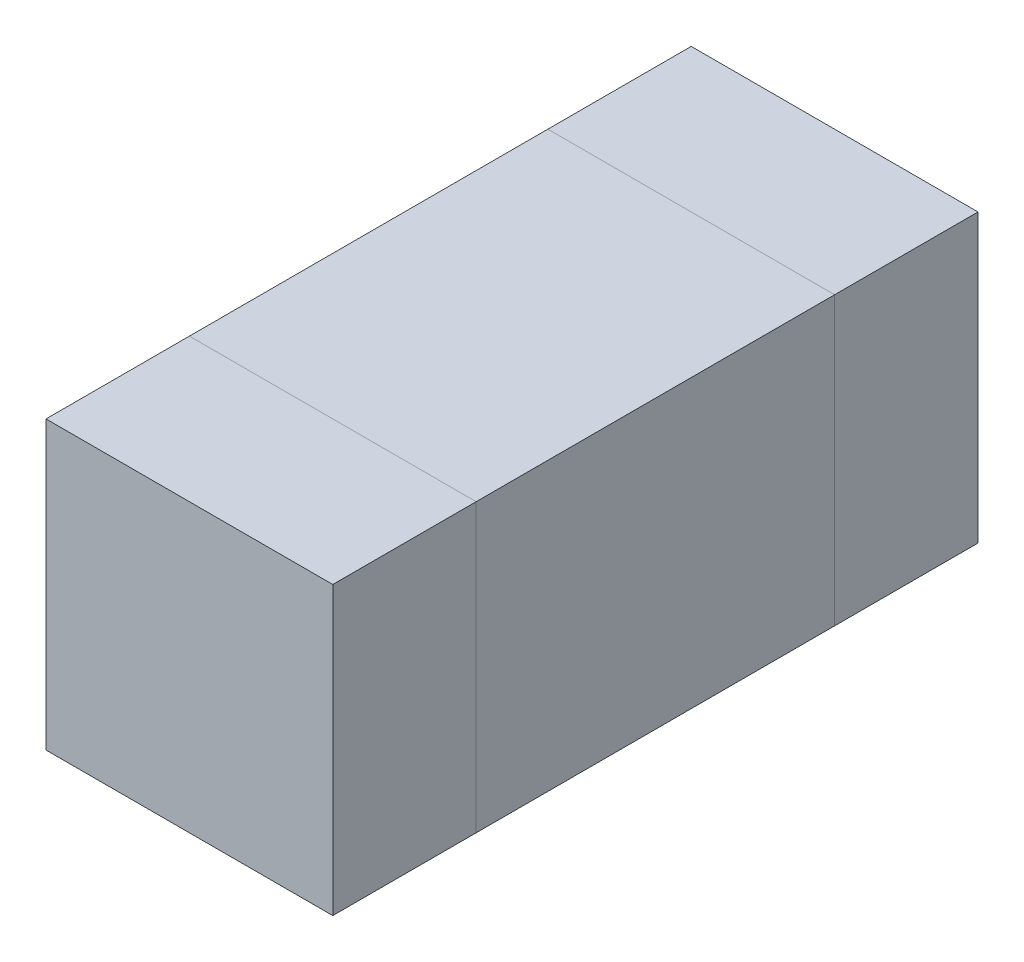
ISO-10303-21;
HEADER;
FILE_DESCRIPTION(('STEP AP214'),'2;1');
FILE_NAME('part.step','',(''),(''),'','','');
FILE_SCHEMA(('AUTOMOTIVE_DESIGN { 1 0 10303 214 1 1 1 1 }'));
ENDSEC;
DATA;
#1=APPLICATION_CONTEXT('core data for automotive mechanical design processes');
#2=APPLICATION_PROTOCOL_DEFINITION('international standard','automotive_design',2000,#1);
#3=PRODUCT_CONTEXT('',#1,'mechanical');
#4=PRODUCT('Part','Part','',(#3));
#5=PRODUCT_RELATED_PRODUCT_CATEGORY('part','',(#4));
#6=PRODUCT_DEFINITION_FORMATION('','',#4);
#7=PRODUCT_DEFINITION_CONTEXT('part definition',#1,'design');
#8=PRODUCT_DEFINITION('design','',#6,#7);
#9=PRODUCT_DEFINITION_SHAPE('','',#8);
#10=(LENGTH_UNIT() NAMED_UNIT(*) SI_UNIT(.MILLI.,.METRE.));
#11=(NAMED_UNIT(*) PLANE_ANGLE_UNIT() SI_UNIT($,.RADIAN.));
#12=(NAMED_UNIT(*) SI_UNIT($,.STERADIAN.) SOLID_ANGLE_UNIT());
#13=UNCERTAINTY_MEASURE_WITH_UNIT(LENGTH_MEASURE(1.E-05),#10,'distance_accuracy_value','');
#14=(GEOMETRIC_REPRESENTATION_CONTEXT(3) GLOBAL_UNCERTAINTY_ASSIGNED_CONTEXT((#13)) GLOBAL_UNIT_ASSIGNED_CONTEXT((#10,
#11,#12)) REPRESENTATION_CONTEXT('',''));
#15=CARTESIAN_POINT('',(0.,0.,0.));
#16=DIRECTION('',(0.,0.,1.));
#17=DIRECTION('',(1.,0.,0.));
#18=AXIS2_PLACEMENT_3D('',#15,#16,#17);
#19=CARTESIAN_POINT('',(0.,0.8,0.));
#20=DIRECTION('',(0.,1.,0.));
#21=DIRECTION('',(0.,0.,1.));
#22=AXIS2_PLACEMENT_3D('',#19,#20,#21);
#23=PLANE('',#22);
#24=DIRECTION('',(0.,0.,-1.));
#25=VECTOR('',#24,1.);
#26=CARTESIAN_POINT('',(-0.4,0.8,-0.5));
#27=LINE('',#26,#25);
#28=CARTESIAN_POINT('',(-0.4,0.8,-0.5));
#29=VERTEX_POINT('',#28);
#30=CARTESIAN_POINT('',(-0.4,0.8,-0.9));
#31=VERTEX_POINT('',#30);
#32=EDGE_CURVE('E55',#29,#31,#27,.T.);
#33=ORIENTED_EDGE('',*,*,#32,.F.);
#34=DIRECTION('',(-1.,0.,0.));
#35=VECTOR('',#34,1.);
#36=CARTESIAN_POINT('',(-0.4,0.8,-0.5));
#37=LINE('',#36,#35);
#38=CARTESIAN_POINT('',(0.4,0.8,-0.5));
#39=VERTEX_POINT('',#38);
#40=EDGE_CURVE('E78',#39,#29,#37,.T.);
#41=ORIENTED_EDGE('',*,*,#40,.F.);
#42=DIRECTION('',(0.,0.,1.));
#43=VECTOR('',#42,1.);
#44=CARTESIAN_POINT('',(0.4,0.8,-0.5));
#45=LINE('',#44,#43);
#46=CARTESIAN_POINT('',(0.4,0.8,-0.9));
#47=VERTEX_POINT('',#46);
#48=EDGE_CURVE('E83',#47,#39,#45,.T.);
#49=ORIENTED_EDGE('',*,*,#48,.F.);
#50=DIRECTION('',(1.,0.,0.));
#51=VECTOR('',#50,1.);
#52=CARTESIAN_POINT('',(-0.4,0.8,-0.9));
#53=LINE('',#52,#51);
#54=EDGE_CURVE('E98',#31,#47,#53,.T.);
#55=ORIENTED_EDGE('',*,*,#54,.F.);
#56=EDGE_LOOP('',(#33,#41,#49,#55));
#57=FACE_BOUND('',#56,.T.);
#58=ADVANCED_FACE('F47',(#57),#23,.T.);
#59=CARTESIAN_POINT('',(0.,0.,0.));
#60=DIRECTION('',(0.,-1.,0.));
#61=DIRECTION('',(0.,0.,-1.));
#62=AXIS2_PLACEMENT_3D('',#59,#60,#61);
#63=PLANE('',#62);
#64=DIRECTION('',(0.,0.,-1.));
#65=VECTOR('',#64,1.);
#66=CARTESIAN_POINT('',(-0.4,0.,-0.5));
#67=LINE('',#66,#65);
#68=CARTESIAN_POINT('',(-0.4,0.,-0.5));
#69=VERTEX_POINT('',#68);
#70=CARTESIAN_POINT('',(-0.4,0.,-0.9));
#71=VERTEX_POINT('',#70);
#72=EDGE_CURVE('E107',#69,#71,#67,.T.);
#73=ORIENTED_EDGE('',*,*,#72,.T.);
#74=DIRECTION('',(1.,0.,0.));
#75=VECTOR('',#74,1.);
#76=CARTESIAN_POINT('',(-0.4,0.,-0.9));
#77=LINE('',#76,#75);
#78=CARTESIAN_POINT('',(0.4,0.,-0.9));
#79=VERTEX_POINT('',#78);
#80=EDGE_CURVE('E96',#71,#79,#77,.T.);
#81=ORIENTED_EDGE('',*,*,#80,.T.);
#82=DIRECTION('',(0.,0.,1.));
#83=VECTOR('',#82,1.);
#84=CARTESIAN_POINT('',(0.4,0.,-0.5));
#85=LINE('',#84,#83);
#86=CARTESIAN_POINT('',(0.4,0.,-0.5));
#87=VERTEX_POINT('',#86);
#88=EDGE_CURVE('E99',#79,#87,#85,.T.);
#89=ORIENTED_EDGE('',*,*,#88,.T.);
#90=DIRECTION('',(-1.,0.,0.));
#91=VECTOR('',#90,1.);
#92=CARTESIAN_POINT('',(-0.4,0.,-0.5));
#93=LINE('',#92,#91);
#94=EDGE_CURVE('E104',#87,#69,#93,.T.);
#95=ORIENTED_EDGE('',*,*,#94,.T.);
#96=EDGE_LOOP('',(#73,#81,#89,#95));
#97=FACE_BOUND('',#96,.T.);
#98=ADVANCED_FACE('F106',(#97),#63,.T.);
#99=CARTESIAN_POINT('',(-0.4,1.69442719099992,-0.9));
#100=DIRECTION('',(0.,0.,-1.));
#101=DIRECTION('',(-1.,0.,0.));
#102=AXIS2_PLACEMENT_3D('',#99,#100,#101);
#103=PLANE('',#102);
#104=DIRECTION('',(0.,-1.,0.));
#105=VECTOR('',#104,1.);
#106=CARTESIAN_POINT('',(-0.4,1.69442719099992,-0.9));
#107=LINE('',#106,#105);
#108=EDGE_CURVE('E12',#31,#71,#107,.T.);
#109=ORIENTED_EDGE('',*,*,#108,.F.);
#110=ORIENTED_EDGE('',*,*,#54,.T.);
#111=DIRECTION('',(0.,-1.,0.));
#112=VECTOR('',#111,1.);
#113=CARTESIAN_POINT('',(0.4,1.69442719099992,-0.9));
#114=LINE('',#113,#112);
#115=EDGE_CURVE('E93',#47,#79,#114,.T.);
#116=ORIENTED_EDGE('',*,*,#115,.T.);
#117=ORIENTED_EDGE('',*,*,#80,.F.);
#118=EDGE_LOOP('',(#109,#110,#116,#117));
#119=FACE_BOUND('',#118,.T.);
#120=ADVANCED_FACE('F94',(#119),#103,.T.);
#121=CARTESIAN_POINT('',(0.4,1.69442719099992,-0.5));
#122=DIRECTION('',(1.,0.,0.));
#123=DIRECTION('',(0.,0.,-1.));
#124=AXIS2_PLACEMENT_3D('',#121,#122,#123);
#125=PLANE('',#124);
#126=ORIENTED_EDGE('',*,*,#115,.F.);
#127=ORIENTED_EDGE('',*,*,#48,.T.);
#128=DIRECTION('',(0.,-1.,0.));
#129=VECTOR('',#128,1.);
#130=CARTESIAN_POINT('',(0.4,1.69442719099992,-0.5));
#131=LINE('',#130,#129);
#132=EDGE_CURVE('E88',#39,#87,#131,.T.);
#133=ORIENTED_EDGE('',*,*,#132,.T.);
#134=ORIENTED_EDGE('',*,*,#88,.F.);
#135=EDGE_LOOP('',(#126,#127,#133,#134));
#136=FACE_BOUND('',#135,.T.);
#137=ADVANCED_FACE('F100',(#136),#125,.T.);
#138=CARTESIAN_POINT('',(-0.4,1.69442719099992,-0.5));
#139=DIRECTION('',(0.,0.,1.));
#140=DIRECTION('',(1.,0.,0.));
#141=AXIS2_PLACEMENT_3D('',#138,#139,#140);
#142=PLANE('',#141);
#143=ORIENTED_EDGE('',*,*,#132,.F.);
#144=ORIENTED_EDGE('',*,*,#40,.T.);
#145=DIRECTION('',(0.,-1.,0.));
#146=VECTOR('',#145,1.);
#147=CARTESIAN_POINT('',(-0.4,1.69442719099992,-0.5));
#148=LINE('',#147,#146);
#149=EDGE_CURVE('E114',#29,#69,#148,.T.);
#150=ORIENTED_EDGE('',*,*,#149,.T.);
#151=ORIENTED_EDGE('',*,*,#94,.F.);
#152=EDGE_LOOP('',(#143,#144,#150,#151));
#153=FACE_BOUND('',#152,.T.);
#154=ADVANCED_FACE('F120',(#153),#142,.T.);
#155=CARTESIAN_POINT('',(-0.4,1.69442719099992,-0.5));
#156=DIRECTION('',(-1.,0.,0.));
#157=DIRECTION('',(0.,0.,1.));
#158=AXIS2_PLACEMENT_3D('',#155,#156,#157);
#159=PLANE('',#158);
#160=ORIENTED_EDGE('',*,*,#149,.F.);
#161=ORIENTED_EDGE('',*,*,#32,.T.);
#162=ORIENTED_EDGE('',*,*,#108,.T.);
#163=ORIENTED_EDGE('',*,*,#72,.F.);
#164=EDGE_LOOP('',(#160,#161,#162,#163));
#165=FACE_BOUND('',#164,.T.);
#166=ADVANCED_FACE('F121',(#165),#159,.T.);
#167=CLOSED_SHELL('',(#58,#98,#120,#137,#154,#166));
#168=MANIFOLD_SOLID_BREP('B2',#167);
#169=CARTESIAN_POINT('',(0.,0.8,0.));
#170=DIRECTION('',(0.,1.,0.));
#171=DIRECTION('',(0.,0.,1.));
#172=AXIS2_PLACEMENT_3D('',#169,#170,#171);
#173=PLANE('',#172);
#174=DIRECTION('',(0.,0.,-1.));
#175=VECTOR('',#174,1.);
#176=CARTESIAN_POINT('',(-0.4,0.8,0.5));
#177=LINE('',#176,#175);
#178=CARTESIAN_POINT('',(-0.4,0.8,0.9));
#179=VERTEX_POINT('',#178);
#180=CARTESIAN_POINT('',(-0.4,0.8,0.5));
#181=VERTEX_POINT('',#180);
#182=EDGE_CURVE('E187',#179,#181,#177,.T.);
#183=ORIENTED_EDGE('',*,*,#182,.F.);
#184=DIRECTION('',(-1.,0.,0.));
#185=VECTOR('',#184,1.);
#186=CARTESIAN_POINT('',(-0.4,0.8,0.9));
#187=LINE('',#186,#185);
#188=CARTESIAN_POINT('',(0.4,0.8,0.9));
#189=VERTEX_POINT('',#188);
#190=EDGE_CURVE('E210',#189,#179,#187,.T.);
#191=ORIENTED_EDGE('',*,*,#190,.F.);
#192=DIRECTION('',(0.,0.,1.));
#193=VECTOR('',#192,1.);
#194=CARTESIAN_POINT('',(0.4,0.8,0.5));
#195=LINE('',#194,#193);
#196=CARTESIAN_POINT('',(0.4,0.8,0.5));
#197=VERTEX_POINT('',#196);
#198=EDGE_CURVE('E215',#197,#189,#195,.T.);
#199=ORIENTED_EDGE('',*,*,#198,.F.);
#200=DIRECTION('',(1.,0.,0.));
#201=VECTOR('',#200,1.);
#202=CARTESIAN_POINT('',(-0.4,0.8,0.5));
#203=LINE('',#202,#201);
#204=EDGE_CURVE('E230',#181,#197,#203,.T.);
#205=ORIENTED_EDGE('',*,*,#204,.F.);
#206=EDGE_LOOP('',(#183,#191,#199,#205));
#207=FACE_BOUND('',#206,.T.);
#208=ADVANCED_FACE('F179',(#207),#173,.T.);
#209=CARTESIAN_POINT('',(0.,0.,0.));
#210=DIRECTION('',(0.,1.,0.));
#211=DIRECTION('',(0.,0.,1.));
#212=AXIS2_PLACEMENT_3D('',#209,#210,#211);
#213=PLANE('',#212);
#214=DIRECTION('',(0.,0.,-1.));
#215=VECTOR('',#214,1.);
#216=CARTESIAN_POINT('',(-0.4,0.,0.5));
#217=LINE('',#216,#215);
#218=CARTESIAN_POINT('',(-0.4,0.,0.9));
#219=VERTEX_POINT('',#218);
#220=CARTESIAN_POINT('',(-0.4,0.,0.5));
#221=VERTEX_POINT('',#220);
#222=EDGE_CURVE('E239',#219,#221,#217,.T.);
#223=ORIENTED_EDGE('',*,*,#222,.T.);
#224=DIRECTION('',(1.,0.,0.));
#225=VECTOR('',#224,1.);
#226=CARTESIAN_POINT('',(-0.4,0.,0.5));
#227=LINE('',#226,#225);
#228=CARTESIAN_POINT('',(0.4,0.,0.5));
#229=VERTEX_POINT('',#228);
#230=EDGE_CURVE('E228',#221,#229,#227,.T.);
#231=ORIENTED_EDGE('',*,*,#230,.T.);
#232=DIRECTION('',(0.,0.,1.));
#233=VECTOR('',#232,1.);
#234=CARTESIAN_POINT('',(0.4,0.,0.5));
#235=LINE('',#234,#233);
#236=CARTESIAN_POINT('',(0.4,0.,0.9));
#237=VERTEX_POINT('',#236);
#238=EDGE_CURVE('E231',#229,#237,#235,.T.);
#239=ORIENTED_EDGE('',*,*,#238,.T.);
#240=DIRECTION('',(-1.,0.,0.));
#241=VECTOR('',#240,1.);
#242=CARTESIAN_POINT('',(-0.4,0.,0.9));
#243=LINE('',#242,#241);
#244=EDGE_CURVE('E236',#237,#219,#243,.T.);
#245=ORIENTED_EDGE('',*,*,#244,.T.);
#246=EDGE_LOOP('',(#223,#231,#239,#245));
#247=FACE_BOUND('',#246,.T.);
#248=ADVANCED_FACE('F238',(#247),#213,.F.);
#249=CARTESIAN_POINT('',(-0.4,1.69442719099992,0.5));
#250=DIRECTION('',(0.,0.,-1.));
#251=DIRECTION('',(-1.,0.,0.));
#252=AXIS2_PLACEMENT_3D('',#249,#250,#251);
#253=PLANE('',#252);
#254=DIRECTION('',(0.,-1.,0.));
#255=VECTOR('',#254,1.);
#256=CARTESIAN_POINT('',(-0.4,1.69442719099992,0.5));
#257=LINE('',#256,#255);
#258=EDGE_CURVE('E45',#181,#221,#257,.T.);
#259=ORIENTED_EDGE('',*,*,#258,.F.);
#260=ORIENTED_EDGE('',*,*,#204,.T.);
#261=DIRECTION('',(0.,-1.,0.));
#262=VECTOR('',#261,1.);
#263=CARTESIAN_POINT('',(0.4,1.69442719099992,0.5));
#264=LINE('',#263,#262);
#265=EDGE_CURVE('E225',#197,#229,#264,.T.);
#266=ORIENTED_EDGE('',*,*,#265,.T.);
#267=ORIENTED_EDGE('',*,*,#230,.F.);
#268=EDGE_LOOP('',(#259,#260,#266,#267));
#269=FACE_BOUND('',#268,.T.);
#270=ADVANCED_FACE('F226',(#269),#253,.T.);
#271=CARTESIAN_POINT('',(0.4,1.69442719099992,0.5));
#272=DIRECTION('',(1.,0.,0.));
#273=DIRECTION('',(0.,0.,-1.));
#274=AXIS2_PLACEMENT_3D('',#271,#272,#273);
#275=PLANE('',#274);
#276=ORIENTED_EDGE('',*,*,#265,.F.);
#277=ORIENTED_EDGE('',*,*,#198,.T.);
#278=DIRECTION('',(0.,-1.,0.));
#279=VECTOR('',#278,1.);
#280=CARTESIAN_POINT('',(0.4,1.69442719099992,0.9));
#281=LINE('',#280,#279);
#282=EDGE_CURVE('E220',#189,#237,#281,.T.);
#283=ORIENTED_EDGE('',*,*,#282,.T.);
#284=ORIENTED_EDGE('',*,*,#238,.F.);
#285=EDGE_LOOP('',(#276,#277,#283,#284));
#286=FACE_BOUND('',#285,.T.);
#287=ADVANCED_FACE('F232',(#286),#275,.T.);
#288=CARTESIAN_POINT('',(-0.4,1.69442719099992,0.9));
#289=DIRECTION('',(0.,0.,1.));
#290=DIRECTION('',(1.,0.,0.));
#291=AXIS2_PLACEMENT_3D('',#288,#289,#290);
#292=PLANE('',#291);
#293=ORIENTED_EDGE('',*,*,#282,.F.);
#294=ORIENTED_EDGE('',*,*,#190,.T.);
#295=DIRECTION('',(0.,-1.,0.));
#296=VECTOR('',#295,1.);
#297=CARTESIAN_POINT('',(-0.4,1.69442719099992,0.9));
#298=LINE('',#297,#296);
#299=EDGE_CURVE('E246',#179,#219,#298,.T.);
#300=ORIENTED_EDGE('',*,*,#299,.T.);
#301=ORIENTED_EDGE('',*,*,#244,.F.);
#302=EDGE_LOOP('',(#293,#294,#300,#301));
#303=FACE_BOUND('',#302,.T.);
#304=ADVANCED_FACE('F252',(#303),#292,.T.);
#305=CARTESIAN_POINT('',(-0.4,1.69442719099992,0.5));
#306=DIRECTION('',(-1.,0.,0.));
#307=DIRECTION('',(0.,0.,1.));
#308=AXIS2_PLACEMENT_3D('',#305,#306,#307);
#309=PLANE('',#308);
#310=ORIENTED_EDGE('',*,*,#299,.F.);
#311=ORIENTED_EDGE('',*,*,#182,.T.);
#312=ORIENTED_EDGE('',*,*,#258,.T.);
#313=ORIENTED_EDGE('',*,*,#222,.F.);
#314=EDGE_LOOP('',(#310,#311,#312,#313));
#315=FACE_BOUND('',#314,.T.);
#316=ADVANCED_FACE('F253',(#315),#309,.T.);
#317=CLOSED_SHELL('',(#208,#248,#270,#287,#304,#316));
#318=MANIFOLD_SOLID_BREP('B6',#317);
#319=CARTESIAN_POINT('',(0.4,0.8,-0.5));
#320=DIRECTION('',(-1.,0.,0.));
#321=DIRECTION('',(0.,0.,1.));
#322=AXIS2_PLACEMENT_3D('',#319,#320,#321);
#323=PLANE('',#322);
#324=DIRECTION('',(0.,0.,-1.));
#325=VECTOR('',#324,1.);
#326=CARTESIAN_POINT('',(0.4,0.,-0.5));
#327=LINE('',#326,#325);
#328=CARTESIAN_POINT('',(0.4,0.,0.5));
#329=VERTEX_POINT('',#328);
#330=CARTESIAN_POINT('',(0.4,0.,-0.5));
#331=VERTEX_POINT('',#330);
#332=EDGE_CURVE('E365',#329,#331,#327,.T.);
#333=ORIENTED_EDGE('',*,*,#332,.T.);
#334=DIRECTION('',(0.,-1.,0.));
#335=VECTOR('',#334,1.);
#336=CARTESIAN_POINT('',(0.4,0.8,-0.5));
#337=LINE('',#336,#335);
#338=CARTESIAN_POINT('',(0.4,0.8,-0.5));
#339=VERTEX_POINT('',#338);
#340=EDGE_CURVE('E177',#339,#331,#337,.T.);
#341=ORIENTED_EDGE('',*,*,#340,.F.);
#342=DIRECTION('',(0.,0.,-1.));
#343=VECTOR('',#342,1.);
#344=CARTESIAN_POINT('',(0.4,0.8,-0.5));
#345=LINE('',#344,#343);
#346=CARTESIAN_POINT('',(0.4,0.8,0.5));
#347=VERTEX_POINT('',#346);
#348=EDGE_CURVE('E353',#347,#339,#345,.T.);
#349=ORIENTED_EDGE('',*,*,#348,.F.);
#350=DIRECTION('',(0.,-1.,0.));
#351=VECTOR('',#350,1.);
#352=CARTESIAN_POINT('',(0.4,0.8,0.5));
#353=LINE('',#352,#351);
#354=EDGE_CURVE('E361',#347,#329,#353,.T.);
#355=ORIENTED_EDGE('',*,*,#354,.T.);
#356=EDGE_LOOP('',(#333,#341,#349,#355));
#357=FACE_BOUND('',#356,.T.);
#358=ADVANCED_FACE('F302',(#357),#323,.F.);
#359=CARTESIAN_POINT('',(-0.4,0.8,-0.5));
#360=DIRECTION('',(0.,0.,1.));
#361=DIRECTION('',(1.,0.,0.));
#362=AXIS2_PLACEMENT_3D('',#359,#360,#361);
#363=PLANE('',#362);
#364=DIRECTION('',(-1.,0.,0.));
#365=VECTOR('',#364,1.);
#366=CARTESIAN_POINT('',(-0.4,0.,-0.5));
#367=LINE('',#366,#365);
#368=CARTESIAN_POINT('',(-0.4,0.,-0.5));
#369=VERTEX_POINT('',#368);
#370=EDGE_CURVE('E357',#331,#369,#367,.T.);
#371=ORIENTED_EDGE('',*,*,#370,.T.);
#372=DIRECTION('',(0.,-1.,0.));
#373=VECTOR('',#372,1.);
#374=CARTESIAN_POINT('',(-0.4,0.8,-0.5));
#375=LINE('',#374,#373);
#376=CARTESIAN_POINT('',(-0.4,0.8,-0.5));
#377=VERTEX_POINT('',#376);
#378=EDGE_CURVE('E310',#377,#369,#375,.T.);
#379=ORIENTED_EDGE('',*,*,#378,.F.);
#380=DIRECTION('',(-1.,0.,0.));
#381=VECTOR('',#380,1.);
#382=CARTESIAN_POINT('',(-0.4,0.8,-0.5));
#383=LINE('',#382,#381);
#384=EDGE_CURVE('E348',#339,#377,#383,.T.);
#385=ORIENTED_EDGE('',*,*,#384,.F.);
#386=ORIENTED_EDGE('',*,*,#340,.T.);
#387=EDGE_LOOP('',(#371,#379,#385,#386));
#388=FACE_BOUND('',#387,.T.);
#389=ADVANCED_FACE('F356',(#388),#363,.F.);
#390=CARTESIAN_POINT('',(-0.4,0.8,-0.5));
#391=DIRECTION('',(1.,0.,0.));
#392=DIRECTION('',(0.,0.,-1.));
#393=AXIS2_PLACEMENT_3D('',#390,#391,#392);
#394=PLANE('',#393);
#395=DIRECTION('',(0.,0.,1.));
#396=VECTOR('',#395,1.);
#397=CARTESIAN_POINT('',(-0.4,0.,-0.5));
#398=LINE('',#397,#396);
#399=CARTESIAN_POINT('',(-0.4,0.,0.5));
#400=VERTEX_POINT('',#399);
#401=EDGE_CURVE('E335',#369,#400,#398,.T.);
#402=ORIENTED_EDGE('',*,*,#401,.T.);
#403=DIRECTION('',(0.,-1.,0.));
#404=VECTOR('',#403,1.);
#405=CARTESIAN_POINT('',(-0.4,0.8,0.5));
#406=LINE('',#405,#404);
#407=CARTESIAN_POINT('',(-0.4,0.8,0.5));
#408=VERTEX_POINT('',#407);
#409=EDGE_CURVE('E358',#408,#400,#406,.T.);
#410=ORIENTED_EDGE('',*,*,#409,.F.);
#411=DIRECTION('',(0.,0.,1.));
#412=VECTOR('',#411,1.);
#413=CARTESIAN_POINT('',(-0.4,0.8,-0.5));
#414=LINE('',#413,#412);
#415=EDGE_CURVE('E351',#377,#408,#414,.T.);
#416=ORIENTED_EDGE('',*,*,#415,.F.);
#417=ORIENTED_EDGE('',*,*,#378,.T.);
#418=EDGE_LOOP('',(#402,#410,#416,#417));
#419=FACE_BOUND('',#418,.T.);
#420=ADVANCED_FACE('F359',(#419),#394,.F.);
#421=CARTESIAN_POINT('',(-0.4,0.8,0.5));
#422=DIRECTION('',(0.,0.,-1.));
#423=DIRECTION('',(-1.,0.,0.));
#424=AXIS2_PLACEMENT_3D('',#421,#422,#423);
#425=PLANE('',#424);
#426=DIRECTION('',(1.,0.,0.));
#427=VECTOR('',#426,1.);
#428=CARTESIAN_POINT('',(-0.4,0.,0.5));
#429=LINE('',#428,#427);
#430=EDGE_CURVE('E341',#400,#329,#429,.T.);
#431=ORIENTED_EDGE('',*,*,#430,.T.);
#432=ORIENTED_EDGE('',*,*,#354,.F.);
#433=DIRECTION('',(1.,0.,0.));
#434=VECTOR('',#433,1.);
#435=CARTESIAN_POINT('',(-0.4,0.8,0.5));
#436=LINE('',#435,#434);
#437=EDGE_CURVE('E318',#408,#347,#436,.T.);
#438=ORIENTED_EDGE('',*,*,#437,.F.);
#439=ORIENTED_EDGE('',*,*,#409,.T.);
#440=EDGE_LOOP('',(#431,#432,#438,#439));
#441=FACE_BOUND('',#440,.T.);
#442=ADVANCED_FACE('F372',(#441),#425,.F.);
#443=CARTESIAN_POINT('',(0.,0.8,0.));
#444=DIRECTION('',(0.,1.,0.));
#445=DIRECTION('',(0.,0.,1.));
#446=AXIS2_PLACEMENT_3D('',#443,#444,#445);
#447=PLANE('',#446);
#448=ORIENTED_EDGE('',*,*,#348,.T.);
#449=ORIENTED_EDGE('',*,*,#384,.T.);
#450=ORIENTED_EDGE('',*,*,#415,.T.);
#451=ORIENTED_EDGE('',*,*,#437,.T.);
#452=EDGE_LOOP('',(#448,#449,#450,#451));
#453=FACE_BOUND('',#452,.T.);
#454=ADVANCED_FACE('F349',(#453),#447,.T.);
#455=CARTESIAN_POINT('',(0.,0.,0.));
#456=DIRECTION('',(0.,1.,0.));
#457=DIRECTION('',(0.,0.,1.));
#458=AXIS2_PLACEMENT_3D('',#455,#456,#457);
#459=PLANE('',#458);
#460=ORIENTED_EDGE('',*,*,#332,.F.);
#461=ORIENTED_EDGE('',*,*,#430,.F.);
#462=ORIENTED_EDGE('',*,*,#401,.F.);
#463=ORIENTED_EDGE('',*,*,#370,.F.);
#464=EDGE_LOOP('',(#460,#461,#462,#463));
#465=FACE_BOUND('',#464,.T.);
#466=ADVANCED_FACE('F375',(#465),#459,.F.);
#467=CLOSED_SHELL('',(#358,#389,#420,#442,#454,#466));
#468=MANIFOLD_SOLID_BREP('B39',#467);
#469=ADVANCED_BREP_SHAPE_REPRESENTATION('',(#18,#168,#318,#468),#14);
#470=SHAPE_DEFINITION_REPRESENTATION(#9,#469);
ENDSEC;
END-ISO-10303-21;
